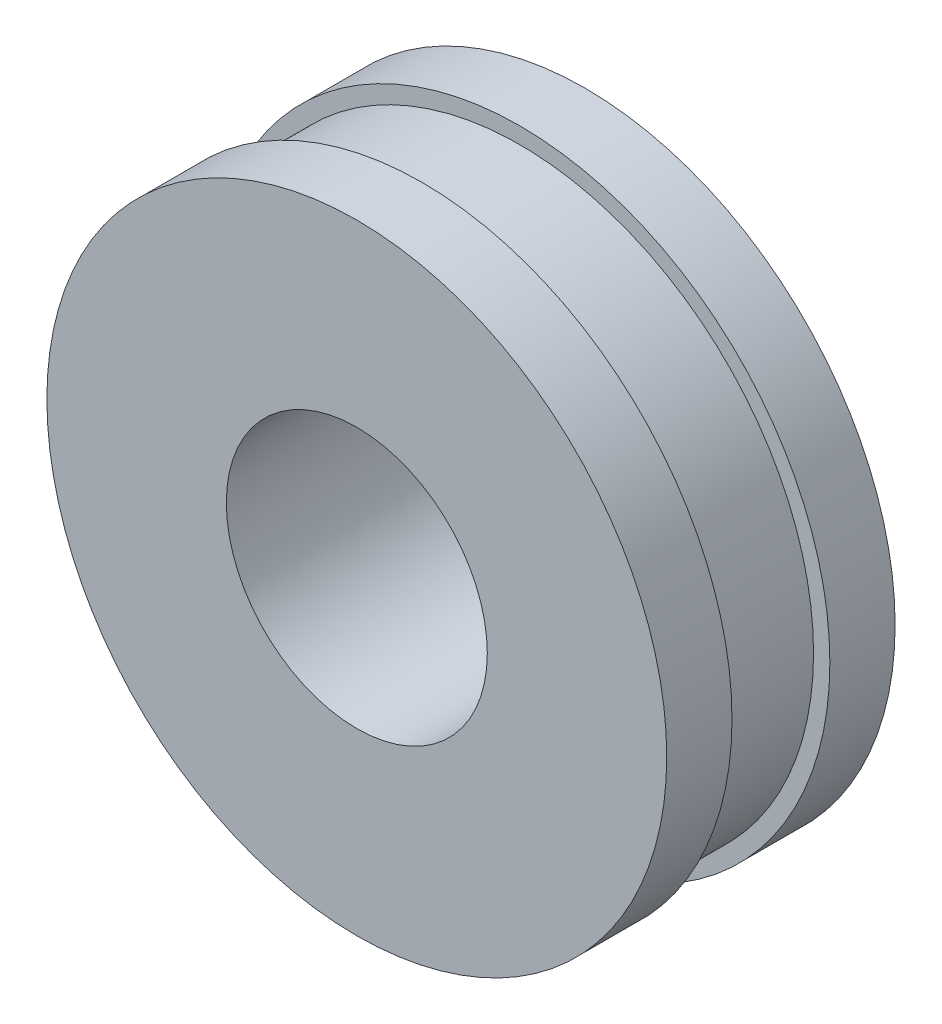
ISO-10303-21;
HEADER;
FILE_DESCRIPTION(('STEP AP214'),'2;1');
FILE_NAME('part.step','',(''),(''),'','','');
FILE_SCHEMA(('AUTOMOTIVE_DESIGN { 1 0 10303 214 1 1 1 1 }'));
ENDSEC;
DATA;
#1=APPLICATION_CONTEXT('core data for automotive mechanical design processes');
#2=APPLICATION_PROTOCOL_DEFINITION('international standard','automotive_design',2000,#1);
#3=PRODUCT_CONTEXT('',#1,'mechanical');
#4=PRODUCT('Part','Part','',(#3));
#5=PRODUCT_RELATED_PRODUCT_CATEGORY('part','',(#4));
#6=PRODUCT_DEFINITION_FORMATION('','',#4);
#7=PRODUCT_DEFINITION_CONTEXT('part definition',#1,'design');
#8=PRODUCT_DEFINITION('design','',#6,#7);
#9=PRODUCT_DEFINITION_SHAPE('','',#8);
#10=(LENGTH_UNIT() NAMED_UNIT(*) SI_UNIT(.MILLI.,.METRE.));
#11=(NAMED_UNIT(*) PLANE_ANGLE_UNIT() SI_UNIT($,.RADIAN.));
#12=(NAMED_UNIT(*) SI_UNIT($,.STERADIAN.) SOLID_ANGLE_UNIT());
#13=UNCERTAINTY_MEASURE_WITH_UNIT(LENGTH_MEASURE(1.E-05),#10,'distance_accuracy_value','');
#14=(GEOMETRIC_REPRESENTATION_CONTEXT(3) GLOBAL_UNCERTAINTY_ASSIGNED_CONTEXT((#13)) GLOBAL_UNIT_ASSIGNED_CONTEXT((#10,
#11,#12)) REPRESENTATION_CONTEXT('',''));
#15=CARTESIAN_POINT('',(0.,0.,0.));
#16=DIRECTION('',(0.,0.,1.));
#17=DIRECTION('',(1.,0.,0.));
#18=AXIS2_PLACEMENT_3D('',#15,#16,#17);
#19=CARTESIAN_POINT('',(0.,0.,2.38125));
#20=DIRECTION('',(0.,0.,-1.));
#21=DIRECTION('',(-1.,0.,0.));
#22=AXIS2_PLACEMENT_3D('',#19,#20,#21);
#23=CYLINDRICAL_SURFACE('',#22,7.14375);
#24=CARTESIAN_POINT('',(0.,0.,2.38125));
#25=DIRECTION('',(0.,0.,1.));
#26=DIRECTION('',(1.,0.,0.));
#27=AXIS2_PLACEMENT_3D('',#24,#25,#26);
#28=CIRCLE('',#27,7.14375);
#29=CARTESIAN_POINT('',(-7.14375,0.,2.38125));
#30=VERTEX_POINT('',#29);
#31=EDGE_CURVE('E10',#30,#30,#28,.T.);
#32=CARTESIAN_POINT('',(0.,0.,0.));
#33=DIRECTION('',(0.,0.,-1.));
#34=DIRECTION('',(-1.,0.,0.));
#35=AXIS2_PLACEMENT_3D('',#32,#33,#34);
#36=CIRCLE('',#35,7.14375);
#37=CARTESIAN_POINT('',(-7.14375,0.,0.));
#38=VERTEX_POINT('',#37);
#39=EDGE_CURVE('E36',#38,#38,#36,.T.);
#40=CARTESIAN_POINT('',(-7.14375,0.,2.38125));
#41=CARTESIAN_POINT('',(-7.14375,0.,2.3564453125));
#42=CARTESIAN_POINT('',(-7.14375,0.,2.331640625));
#43=CARTESIAN_POINT('',(-7.14375,0.,2.28203125));
#44=CARTESIAN_POINT('',(-7.14375,0.,2.2572265625));
#45=CARTESIAN_POINT('',(-7.14375,0.,2.2076171875));
#46=CARTESIAN_POINT('',(-7.14375,0.,2.1828125));
#47=CARTESIAN_POINT('',(-7.14375,0.,2.133203125));
#48=CARTESIAN_POINT('',(-7.14375,0.,2.1083984375));
#49=CARTESIAN_POINT('',(-7.14375,0.,2.0587890625));
#50=CARTESIAN_POINT('',(-7.14375,0.,2.033984375));
#51=CARTESIAN_POINT('',(-7.14375,0.,1.984375));
#52=CARTESIAN_POINT('',(-7.14375,0.,1.9595703125));
#53=CARTESIAN_POINT('',(-7.14375,0.,1.9099609375));
#54=CARTESIAN_POINT('',(-7.14375,0.,1.88515625));
#55=CARTESIAN_POINT('',(-7.14375,0.,1.835546875));
#56=CARTESIAN_POINT('',(-7.14375,0.,1.8107421875));
#57=CARTESIAN_POINT('',(-7.14375,0.,1.7611328125));
#58=CARTESIAN_POINT('',(-7.14375,0.,1.736328125));
#59=CARTESIAN_POINT('',(-7.14375,0.,1.68671875));
#60=CARTESIAN_POINT('',(-7.14375,0.,1.6619140625));
#61=CARTESIAN_POINT('',(-7.14375,0.,1.6123046875));
#62=CARTESIAN_POINT('',(-7.14375,0.,1.5875));
#63=CARTESIAN_POINT('',(-7.14375,0.,1.537890625));
#64=CARTESIAN_POINT('',(-7.14375,0.,1.5130859375));
#65=CARTESIAN_POINT('',(-7.14375,0.,1.4634765625));
#66=CARTESIAN_POINT('',(-7.14375,0.,1.438671875));
#67=CARTESIAN_POINT('',(-7.14375,0.,1.3890625));
#68=CARTESIAN_POINT('',(-7.14375,0.,1.3642578125));
#69=CARTESIAN_POINT('',(-7.14375,0.,1.3146484375));
#70=CARTESIAN_POINT('',(-7.14375,0.,1.28984375));
#71=CARTESIAN_POINT('',(-7.14375,0.,1.240234375));
#72=CARTESIAN_POINT('',(-7.14375,0.,1.2154296875));
#73=CARTESIAN_POINT('',(-7.14375,0.,1.1658203125));
#74=CARTESIAN_POINT('',(-7.14375,0.,1.141015625));
#75=CARTESIAN_POINT('',(-7.14375,0.,1.09140625));
#76=CARTESIAN_POINT('',(-7.14375,0.,1.0666015625));
#77=CARTESIAN_POINT('',(-7.14375,0.,1.0169921875));
#78=CARTESIAN_POINT('',(-7.14375,0.,0.9921875));
#79=CARTESIAN_POINT('',(-7.14375,0.,0.942578125));
#80=CARTESIAN_POINT('',(-7.14375,0.,0.9177734375));
#81=CARTESIAN_POINT('',(-7.14375,0.,0.8681640625));
#82=CARTESIAN_POINT('',(-7.14375,0.,0.843359375));
#83=CARTESIAN_POINT('',(-7.14375,0.,0.79375));
#84=CARTESIAN_POINT('',(-7.14375,0.,0.7689453125));
#85=CARTESIAN_POINT('',(-7.14375,0.,0.7193359375));
#86=CARTESIAN_POINT('',(-7.14375,0.,0.69453125));
#87=CARTESIAN_POINT('',(-7.14375,0.,0.644921875));
#88=CARTESIAN_POINT('',(-7.14375,0.,0.6201171875));
#89=CARTESIAN_POINT('',(-7.14375,0.,0.5705078125));
#90=CARTESIAN_POINT('',(-7.14375,0.,0.545703125));
#91=CARTESIAN_POINT('',(-7.14375,0.,0.49609375));
#92=CARTESIAN_POINT('',(-7.14375,0.,0.4712890625));
#93=CARTESIAN_POINT('',(-7.14375,0.,0.4216796875));
#94=CARTESIAN_POINT('',(-7.14375,0.,0.396875));
#95=CARTESIAN_POINT('',(-7.14375,0.,0.347265625));
#96=CARTESIAN_POINT('',(-7.14375,0.,0.3224609375));
#97=CARTESIAN_POINT('',(-7.14375,0.,0.2728515625));
#98=CARTESIAN_POINT('',(-7.14375,0.,0.248046875));
#99=CARTESIAN_POINT('',(-7.14375,0.,0.1984375));
#100=CARTESIAN_POINT('',(-7.14375,0.,0.1736328125));
#101=CARTESIAN_POINT('',(-7.14375,0.,0.1240234375));
#102=CARTESIAN_POINT('',(-7.14375,0.,0.0992187500000001));
#103=CARTESIAN_POINT('',(-7.14375,0.,0.049609375));
#104=CARTESIAN_POINT('',(-7.14375,0.,0.0248046875));
#105=CARTESIAN_POINT('',(-7.14375,0.,0.));
#106=B_SPLINE_CURVE_WITH_KNOTS('',3,(#40,#41,#42,#43,#44,#45,#46,#47,#48,#49,#50,#51,#52,#53,
#54,#55,#56,#57,#58,#59,#60,#61,#62,#63,#64,#65,#66,#67,#68,#69,#70,#71,#72,#73,#74,#75,#76,#77,
#78,#79,#80,#81,#82,#83,#84,#85,#86,#87,#88,#89,#90,#91,#92,#93,#94,#95,#96,#97,#98,#99,#100,
#101,#102,#103,#104,#105),.UNSPECIFIED.,.F.,.F.,(4,2,2,2,2,2,2,2,2,2,2,2,2,2,2,2,2,2,2,2,2,2,2,
2,2,2,2,2,2,2,2,2,4),(0.,0.0744140624999996,0.148828125,0.2232421875,0.29765625,0.3720703125,
0.446484375,0.5208984375,0.5953125,0.6697265625,0.744140625,0.8185546875,0.89296875,
0.9673828125,1.041796875,1.1162109375,1.190625,1.2650390625,1.339453125,1.4138671875,1.48828125,
1.5626953125,1.637109375,1.7115234375,1.7859375,1.8603515625,1.934765625,2.0091796875,
2.08359375,2.1580078125,2.232421875,2.3068359375,2.38125),.UNSPECIFIED.);
#107=EDGE_CURVE('BSEAM30',#30,#38,#106,.T.);
#108=ORIENTED_EDGE('',*,*,#31,.F.);
#109=ORIENTED_EDGE('',*,*,#39,.F.);
#110=ORIENTED_EDGE('',*,*,#107,.T.);
#111=ORIENTED_EDGE('',*,*,#107,.F.);
#112=EDGE_LOOP('',(#108,#110,#109,#111));
#113=FACE_BOUND('',#112,.T.);
#114=ADVANCED_FACE('F30',(#113),#23,.T.);
#115=CARTESIAN_POINT('',(0.,0.,2.38125));
#116=DIRECTION('',(0.,0.,-1.));
#117=DIRECTION('',(-1.,0.,0.));
#118=AXIS2_PLACEMENT_3D('',#115,#116,#117);
#119=CYLINDRICAL_SURFACE('',#118,3.175);
#120=CARTESIAN_POINT('',(0.,0.,-1.5875));
#121=DIRECTION('',(0.,0.,-1.));
#122=DIRECTION('',(-1.,0.,0.));
#123=AXIS2_PLACEMENT_3D('',#120,#121,#122);
#124=CIRCLE('',#123,3.175);
#125=CARTESIAN_POINT('',(-3.175,0.,-1.5875));
#126=VERTEX_POINT('',#125);
#127=EDGE_CURVE('E48',#126,#126,#124,.T.);
#128=CARTESIAN_POINT('',(0.,0.,3.96875));
#129=DIRECTION('',(0.,0.,1.));
#130=DIRECTION('',(1.,0.,0.));
#131=AXIS2_PLACEMENT_3D('',#128,#129,#130);
#132=CIRCLE('',#131,3.175);
#133=CARTESIAN_POINT('',(-3.175,0.,3.96875));
#134=VERTEX_POINT('',#133);
#135=EDGE_CURVE('E56',#134,#134,#132,.T.);
#136=CARTESIAN_POINT('',(-3.175,0.,-1.5875));
#137=CARTESIAN_POINT('',(-3.175,0.,-1.52962239583333));
#138=CARTESIAN_POINT('',(-3.175,0.,-1.47174479166667));
#139=CARTESIAN_POINT('',(-3.175,0.,-1.35598958333333));
#140=CARTESIAN_POINT('',(-3.175,0.,-1.29811197916667));
#141=CARTESIAN_POINT('',(-3.175,0.,-1.18235677083333));
#142=CARTESIAN_POINT('',(-3.175,0.,-1.12447916666667));
#143=CARTESIAN_POINT('',(-3.175,0.,-1.00872395833333));
#144=CARTESIAN_POINT('',(-3.175,0.,-0.950846354166666));
#145=CARTESIAN_POINT('',(-3.175,0.,-0.835091145833333));
#146=CARTESIAN_POINT('',(-3.175,0.,-0.777213541666666));
#147=CARTESIAN_POINT('',(-3.175,0.,-0.661458333333333));
#148=CARTESIAN_POINT('',(-3.175,0.,-0.603580729166666));
#149=CARTESIAN_POINT('',(-3.175,0.,-0.487825520833333));
#150=CARTESIAN_POINT('',(-3.175,0.,-0.429947916666666));
#151=CARTESIAN_POINT('',(-3.175,0.,-0.314192708333333));
#152=CARTESIAN_POINT('',(-3.175,0.,-0.256315104166666));
#153=CARTESIAN_POINT('',(-3.175,0.,-0.140559895833333));
#154=CARTESIAN_POINT('',(-3.175,0.,-0.0826822916666662));
#155=CARTESIAN_POINT('',(-3.175,0.,0.0330729166666671));
#156=CARTESIAN_POINT('',(-3.175,0.,0.0909505208333336));
#157=CARTESIAN_POINT('',(-3.175,0.,0.206705729166667));
#158=CARTESIAN_POINT('',(-3.175,0.,0.264583333333334));
#159=CARTESIAN_POINT('',(-3.175,0.,0.380338541666667));
#160=CARTESIAN_POINT('',(-3.175,0.,0.438216145833334));
#161=CARTESIAN_POINT('',(-3.175,0.,0.553971354166667));
#162=CARTESIAN_POINT('',(-3.175,0.,0.611848958333334));
#163=CARTESIAN_POINT('',(-3.175,0.,0.727604166666667));
#164=CARTESIAN_POINT('',(-3.175,0.,0.785481770833333));
#165=CARTESIAN_POINT('',(-3.175,0.,0.901236979166667));
#166=CARTESIAN_POINT('',(-3.175,0.,0.959114583333333));
#167=CARTESIAN_POINT('',(-3.175,0.,1.07486979166667));
#168=CARTESIAN_POINT('',(-3.175,0.,1.13274739583333));
#169=CARTESIAN_POINT('',(-3.175,0.,1.24850260416667));
#170=CARTESIAN_POINT('',(-3.175,0.,1.30638020833333));
#171=CARTESIAN_POINT('',(-3.175,0.,1.42213541666667));
#172=CARTESIAN_POINT('',(-3.175,0.,1.48001302083333));
#173=CARTESIAN_POINT('',(-3.175,0.,1.59576822916667));
#174=CARTESIAN_POINT('',(-3.175,0.,1.65364583333333));
#175=CARTESIAN_POINT('',(-3.175,0.,1.76940104166667));
#176=CARTESIAN_POINT('',(-3.175,0.,1.82727864583333));
#177=CARTESIAN_POINT('',(-3.175,0.,1.94303385416667));
#178=CARTESIAN_POINT('',(-3.175,0.,2.00091145833333));
#179=CARTESIAN_POINT('',(-3.175,0.,2.11666666666667));
#180=CARTESIAN_POINT('',(-3.175,0.,2.17454427083333));
#181=CARTESIAN_POINT('',(-3.175,0.,2.29029947916667));
#182=CARTESIAN_POINT('',(-3.175,0.,2.34817708333333));
#183=CARTESIAN_POINT('',(-3.175,0.,2.46393229166667));
#184=CARTESIAN_POINT('',(-3.175,0.,2.52180989583333));
#185=CARTESIAN_POINT('',(-3.175,0.,2.63756510416667));
#186=CARTESIAN_POINT('',(-3.175,0.,2.69544270833333));
#187=CARTESIAN_POINT('',(-3.175,0.,2.81119791666667));
#188=CARTESIAN_POINT('',(-3.175,0.,2.86907552083333));
#189=CARTESIAN_POINT('',(-3.175,0.,2.98483072916667));
#190=CARTESIAN_POINT('',(-3.175,0.,3.04270833333333));
#191=CARTESIAN_POINT('',(-3.175,0.,3.15846354166667));
#192=CARTESIAN_POINT('',(-3.175,0.,3.21634114583333));
#193=CARTESIAN_POINT('',(-3.175,0.,3.33209635416667));
#194=CARTESIAN_POINT('',(-3.175,0.,3.38997395833333));
#195=CARTESIAN_POINT('',(-3.175,0.,3.50572916666667));
#196=CARTESIAN_POINT('',(-3.175,0.,3.56360677083333));
#197=CARTESIAN_POINT('',(-3.175,0.,3.67936197916667));
#198=CARTESIAN_POINT('',(-3.175,0.,3.73723958333333));
#199=CARTESIAN_POINT('',(-3.175,0.,3.85299479166667));
#200=CARTESIAN_POINT('',(-3.175,0.,3.91087239583333));
#201=CARTESIAN_POINT('',(-3.175,0.,3.96875));
#202=B_SPLINE_CURVE_WITH_KNOTS('',3,(#136,#137,#138,#139,#140,#141,#142,#143,#144,#145,#146,
#147,#148,#149,#150,#151,#152,#153,#154,#155,#156,#157,#158,#159,#160,#161,#162,#163,#164,#165,
#166,#167,#168,#169,#170,#171,#172,#173,#174,#175,#176,#177,#178,#179,#180,#181,#182,#183,#184,
#185,#186,#187,#188,#189,#190,#191,#192,#193,#194,#195,#196,#197,#198,#199,#200,#201),
.UNSPECIFIED.,.F.,.F.,(4,2,2,2,2,2,2,2,2,2,2,2,2,2,2,2,2,2,2,2,2,2,2,2,2,2,2,2,2,2,2,2,4),(0.,
0.1736328125,0.347265624999999,0.520898437499999,0.694531249999999,0.868164062499999,
1.041796875,1.2154296875,1.3890625,1.5626953125,1.736328125,1.9099609375,2.08359375,
2.2572265625,2.430859375,2.6044921875,2.778125,2.9517578125,3.125390625,3.2990234375,3.47265625,
3.6462890625,3.819921875,3.9935546875,4.1671875,4.3408203125,4.514453125,4.6880859375,
4.86171875,5.0353515625,5.208984375,5.3826171875,5.55625),.UNSPECIFIED.);
#203=EDGE_CURVE('BSEAM62',#126,#134,#202,.T.);
#204=ORIENTED_EDGE('',*,*,#127,.T.);
#205=ORIENTED_EDGE('',*,*,#135,.T.);
#206=ORIENTED_EDGE('',*,*,#203,.T.);
#207=ORIENTED_EDGE('',*,*,#203,.F.);
#208=EDGE_LOOP('',(#204,#206,#205,#207));
#209=FACE_BOUND('',#208,.T.);
#210=ADVANCED_FACE('F62',(#209),#119,.F.);
#211=CARTESIAN_POINT('',(0.,0.,0.));
#212=DIRECTION('',(0.,0.,-1.));
#213=DIRECTION('',(-1.,0.,0.));
#214=AXIS2_PLACEMENT_3D('',#211,#212,#213);
#215=PLANE('',#214);
#216=CARTESIAN_POINT('',(0.,0.,0.));
#217=DIRECTION('',(0.,0.,-1.));
#218=DIRECTION('',(-1.,0.,0.));
#219=AXIS2_PLACEMENT_3D('',#216,#217,#218);
#220=CIRCLE('',#219,7.540625);
#221=CARTESIAN_POINT('',(-7.540625,0.,0.));
#222=VERTEX_POINT('',#221);
#223=EDGE_CURVE('E44',#222,#222,#220,.T.);
#224=ORIENTED_EDGE('',*,*,#223,.F.);
#225=EDGE_LOOP('',(#224));
#226=FACE_BOUND('',#225,.T.);
#227=ORIENTED_EDGE('',*,*,#39,.T.);
#228=EDGE_LOOP('',(#227));
#229=FACE_BOUND('',#228,.T.);
#230=ADVANCED_FACE('F84',(#226,#229),#215,.F.);
#231=CARTESIAN_POINT('',(0.,0.,-1.5875));
#232=DIRECTION('',(0.,0.,-1.));
#233=DIRECTION('',(-1.,0.,0.));
#234=AXIS2_PLACEMENT_3D('',#231,#232,#233);
#235=PLANE('',#234);
#236=CARTESIAN_POINT('',(0.,0.,-1.5875));
#237=DIRECTION('',(0.,0.,-1.));
#238=DIRECTION('',(-1.,0.,0.));
#239=AXIS2_PLACEMENT_3D('',#236,#237,#238);
#240=CIRCLE('',#239,7.540625);
#241=CARTESIAN_POINT('',(-7.540625,0.,-1.5875));
#242=VERTEX_POINT('',#241);
#243=EDGE_CURVE('E40',#242,#242,#240,.T.);
#244=ORIENTED_EDGE('',*,*,#243,.T.);
#245=EDGE_LOOP('',(#244));
#246=FACE_BOUND('',#245,.T.);
#247=ORIENTED_EDGE('',*,*,#127,.F.);
#248=EDGE_LOOP('',(#247));
#249=FACE_BOUND('',#248,.T.);
#250=ADVANCED_FACE('F90',(#246,#249),#235,.T.);
#251=CARTESIAN_POINT('',(0.,0.,-1.5875));
#252=DIRECTION('',(0.,0.,1.));
#253=DIRECTION('',(1.,0.,0.));
#254=AXIS2_PLACEMENT_3D('',#251,#252,#253);
#255=CYLINDRICAL_SURFACE('',#254,7.540625);
#256=ORIENTED_EDGE('',*,*,#243,.F.);
#257=EDGE_LOOP('',(#256));
#258=FACE_BOUND('',#257,.T.);
#259=ORIENTED_EDGE('',*,*,#223,.T.);
#260=EDGE_LOOP('',(#259));
#261=FACE_BOUND('',#260,.T.);
#262=ADVANCED_FACE('F76',(#258,#261),#255,.T.);
#263=CARTESIAN_POINT('',(0.,0.,2.38125));
#264=DIRECTION('',(0.,0.,1.));
#265=DIRECTION('',(1.,0.,0.));
#266=AXIS2_PLACEMENT_3D('',#263,#264,#265);
#267=PLANE('',#266);
#268=CARTESIAN_POINT('',(0.,0.,2.38125));
#269=DIRECTION('',(0.,0.,1.));
#270=DIRECTION('',(1.,0.,0.));
#271=AXIS2_PLACEMENT_3D('',#268,#269,#270);
#272=CIRCLE('',#271,7.540625);
#273=CARTESIAN_POINT('',(7.540625,0.,2.38125));
#274=VERTEX_POINT('',#273);
#275=EDGE_CURVE('E53',#274,#274,#272,.T.);
#276=ORIENTED_EDGE('',*,*,#275,.F.);
#277=EDGE_LOOP('',(#276));
#278=FACE_BOUND('',#277,.T.);
#279=ORIENTED_EDGE('',*,*,#31,.T.);
#280=EDGE_LOOP('',(#279));
#281=FACE_BOUND('',#280,.T.);
#282=ADVANCED_FACE('F67',(#278,#281),#267,.F.);
#283=CARTESIAN_POINT('',(0.,0.,3.96875));
#284=DIRECTION('',(0.,0.,1.));
#285=DIRECTION('',(1.,0.,0.));
#286=AXIS2_PLACEMENT_3D('',#283,#284,#285);
#287=PLANE('',#286);
#288=CARTESIAN_POINT('',(0.,0.,3.96875));
#289=DIRECTION('',(0.,0.,1.));
#290=DIRECTION('',(1.,0.,0.));
#291=AXIS2_PLACEMENT_3D('',#288,#289,#290);
#292=CIRCLE('',#291,7.540625);
#293=CARTESIAN_POINT('',(7.540625,0.,3.96875));
#294=VERTEX_POINT('',#293);
#295=EDGE_CURVE('E52',#294,#294,#292,.T.);
#296=ORIENTED_EDGE('',*,*,#295,.T.);
#297=EDGE_LOOP('',(#296));
#298=FACE_BOUND('',#297,.T.);
#299=ORIENTED_EDGE('',*,*,#135,.F.);
#300=EDGE_LOOP('',(#299));
#301=FACE_BOUND('',#300,.T.);
#302=ADVANCED_FACE('F64',(#298,#301),#287,.T.);
#303=CARTESIAN_POINT('',(0.,0.,3.96875));
#304=DIRECTION('',(0.,0.,-1.));
#305=DIRECTION('',(-1.,0.,0.));
#306=AXIS2_PLACEMENT_3D('',#303,#304,#305);
#307=CYLINDRICAL_SURFACE('',#306,7.540625);
#308=ORIENTED_EDGE('',*,*,#295,.F.);
#309=EDGE_LOOP('',(#308));
#310=FACE_BOUND('',#309,.T.);
#311=ORIENTED_EDGE('',*,*,#275,.T.);
#312=EDGE_LOOP('',(#311));
#313=FACE_BOUND('',#312,.T.);
#314=ADVANCED_FACE('F66',(#310,#313),#307,.T.);
#315=CLOSED_SHELL('',(#114,#210,#230,#250,#262,#282,#302,#314));
#316=MANIFOLD_SOLID_BREP('B2',#315);
#317=ADVANCED_BREP_SHAPE_REPRESENTATION('',(#18,#316),#14);
#318=SHAPE_DEFINITION_REPRESENTATION(#9,#317);
ENDSEC;
END-ISO-10303-21;
